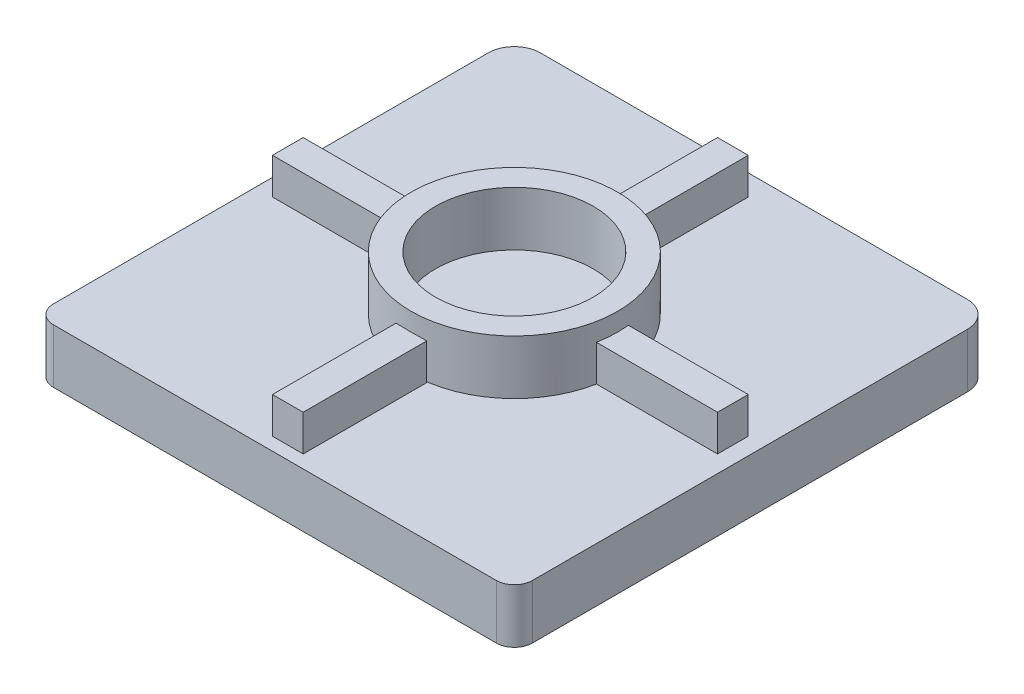
ISO-10303-21;
HEADER;
FILE_DESCRIPTION(('STEP AP214'),'2;1');
FILE_NAME('part.step','',(''),(''),'','','');
FILE_SCHEMA(('AUTOMOTIVE_DESIGN { 1 0 10303 214 1 1 1 1 }'));
ENDSEC;
DATA;
#1=APPLICATION_CONTEXT('core data for automotive mechanical design processes');
#2=APPLICATION_PROTOCOL_DEFINITION('international standard','automotive_design',2000,#1);
#3=PRODUCT_CONTEXT('',#1,'mechanical');
#4=PRODUCT('Part','Part','',(#3));
#5=PRODUCT_RELATED_PRODUCT_CATEGORY('part','',(#4));
#6=PRODUCT_DEFINITION_FORMATION('','',#4);
#7=PRODUCT_DEFINITION_CONTEXT('part definition',#1,'design');
#8=PRODUCT_DEFINITION('design','',#6,#7);
#9=PRODUCT_DEFINITION_SHAPE('','',#8);
#10=(LENGTH_UNIT() NAMED_UNIT(*) SI_UNIT(.MILLI.,.METRE.));
#11=(NAMED_UNIT(*) PLANE_ANGLE_UNIT() SI_UNIT($,.RADIAN.));
#12=(NAMED_UNIT(*) SI_UNIT($,.STERADIAN.) SOLID_ANGLE_UNIT());
#13=UNCERTAINTY_MEASURE_WITH_UNIT(LENGTH_MEASURE(1.E-05),#10,'distance_accuracy_value','');
#14=(GEOMETRIC_REPRESENTATION_CONTEXT(3) GLOBAL_UNCERTAINTY_ASSIGNED_CONTEXT((#13)) GLOBAL_UNIT_ASSIGNED_CONTEXT((#10,
#11,#12)) REPRESENTATION_CONTEXT('',''));
#15=CARTESIAN_POINT('',(0.,0.,0.));
#16=DIRECTION('',(0.,0.,1.));
#17=DIRECTION('',(1.,0.,0.));
#18=AXIS2_PLACEMENT_3D('',#15,#16,#17);
#19=CARTESIAN_POINT('',(4.572,0.,-72.6121428427258));
#20=DIRECTION('',(0.,1.,0.));
#21=DIRECTION('',(0.,0.,1.));
#22=AXIS2_PLACEMENT_3D('',#19,#20,#21);
#23=PLANE('',#22);
#24=CARTESIAN_POINT('',(4.572,0.,-72.6121428427258));
#25=DIRECTION('',(0.,1.,0.));
#26=DIRECTION('',(0.,0.,1.));
#27=AXIS2_PLACEMENT_3D('',#24,#25,#26);
#28=CIRCLE('',#27,4.572);
#29=CARTESIAN_POINT('',(4.572,0.,-77.1841428427258));
#30=VERTEX_POINT('',#29);
#31=CARTESIAN_POINT('',(0.,0.,-72.6121428427258));
#32=VERTEX_POINT('',#31);
#33=EDGE_CURVE('E312',#30,#32,#28,.T.);
#34=ORIENTED_EDGE('',*,*,#33,.T.);
#35=DIRECTION('',(0.,0.,1.));
#36=VECTOR('',#35,1.);
#37=CARTESIAN_POINT('',(0.,0.,3.7580703769303));
#38=LINE('',#37,#36);
#39=CARTESIAN_POINT('',(0.,0.,3.7580703769303));
#40=VERTEX_POINT('',#39);
#41=EDGE_CURVE('E345',#32,#40,#38,.T.);
#42=ORIENTED_EDGE('',*,*,#41,.T.);
#43=CARTESIAN_POINT('',(3.175,0.,3.75807037693033));
#44=DIRECTION('',(0.,1.,0.));
#45=DIRECTION('',(0.,0.,-1.));
#46=AXIS2_PLACEMENT_3D('',#43,#44,#45);
#47=CIRCLE('',#46,3.175);
#48=CARTESIAN_POINT('',(3.17500000000002,0.,6.93307037693033));
#49=VERTEX_POINT('',#48);
#50=EDGE_CURVE('E348',#40,#49,#47,.T.);
#51=ORIENTED_EDGE('',*,*,#50,.T.);
#52=DIRECTION('',(1.,0.,0.));
#53=VECTOR('',#52,1.);
#54=CARTESIAN_POINT('',(80.9527959262744,0.,6.93307037693033));
#55=LINE('',#54,#53);
#56=CARTESIAN_POINT('',(80.9527959262744,0.,6.93307037693033));
#57=VERTEX_POINT('',#56);
#58=EDGE_CURVE('E351',#49,#57,#55,.T.);
#59=ORIENTED_EDGE('',*,*,#58,.T.);
#60=CARTESIAN_POINT('',(80.9527959262744,0.,3.75807037693033));
#61=DIRECTION('',(0.,1.,0.));
#62=DIRECTION('',(0.,0.,-1.));
#63=AXIS2_PLACEMENT_3D('',#60,#61,#62);
#64=CIRCLE('',#63,3.175);
#65=CARTESIAN_POINT('',(84.1277959262744,0.,3.75807037693031));
#66=VERTEX_POINT('',#65);
#67=EDGE_CURVE('E354',#57,#66,#64,.T.);
#68=ORIENTED_EDGE('',*,*,#67,.T.);
#69=DIRECTION('',(0.,0.,-1.));
#70=VECTOR('',#69,1.);
#71=CARTESIAN_POINT('',(84.1277959262744,0.,3.75807037693031));
#72=LINE('',#71,#70);
#73=CARTESIAN_POINT('',(84.1277959262744,0.,-72.6121428427258));
#74=VERTEX_POINT('',#73);
#75=EDGE_CURVE('E357',#66,#74,#72,.T.);
#76=ORIENTED_EDGE('',*,*,#75,.T.);
#77=CARTESIAN_POINT('',(79.5557959262744,0.,-72.6121428427258));
#78=DIRECTION('',(0.,1.,0.));
#79=DIRECTION('',(0.,0.,1.));
#80=AXIS2_PLACEMENT_3D('',#77,#78,#79);
#81=CIRCLE('',#80,4.57200000000001);
#82=CARTESIAN_POINT('',(79.5557959262744,0.,-77.1841428427258));
#83=VERTEX_POINT('',#82);
#84=EDGE_CURVE('E360',#74,#83,#81,.T.);
#85=ORIENTED_EDGE('',*,*,#84,.T.);
#86=DIRECTION('',(-1.,0.,0.));
#87=VECTOR('',#86,1.);
#88=CARTESIAN_POINT('',(4.572,0.,-77.1841428427258));
#89=LINE('',#88,#87);
#90=EDGE_CURVE('E321',#83,#30,#89,.T.);
#91=ORIENTED_EDGE('',*,*,#90,.T.);
#92=EDGE_LOOP('',(#34,#42,#51,#59,#68,#76,#85,#91));
#93=FACE_BOUND('',#92,.T.);
#94=DIRECTION('',(-1.,0.,0.));
#95=VECTOR('',#94,1.);
#96=CARTESIAN_POINT('',(39.3670969734219,0.,-73.5093637595236));
#97=LINE('',#96,#95);
#98=CARTESIAN_POINT('',(44.7606989528534,0.,-73.5093637595235));
#99=VERTEX_POINT('',#98);
#100=CARTESIAN_POINT('',(39.3670969734219,0.,-73.5093637595236));
#101=VERTEX_POINT('',#100);
#102=EDGE_CURVE('E46',#99,#101,#97,.T.);
#103=ORIENTED_EDGE('',*,*,#102,.F.);
#104=DIRECTION('',(0.,0.,-1.));
#105=VECTOR('',#104,1.);
#106=CARTESIAN_POINT('',(44.7606989528532,0.,-51.8172298559358));
#107=LINE('',#106,#105);
#108=CARTESIAN_POINT('',(44.7606989528532,0.,-53.0644207712562));
#109=VERTEX_POINT('',#108);
#110=EDGE_CURVE('E223',#109,#99,#107,.T.);
#111=ORIENTED_EDGE('',*,*,#110,.F.);
#112=CARTESIAN_POINT('',(42.0638979631372,0.,-35.1308275862069));
#113=DIRECTION('',(0.,1.,0.));
#114=DIRECTION('',(0.,0.,1.));
#115=AXIS2_PLACEMENT_3D('',#112,#113,#114);
#116=CIRCLE('',#115,18.1352281514454);
#117=CARTESIAN_POINT('',(60.0892804193896,0.,-37.1238372226135));
#118=VERTEX_POINT('',#117);
#119=EDGE_CURVE('E313',#118,#109,#116,.T.);
#120=ORIENTED_EDGE('',*,*,#119,.F.);
#121=DIRECTION('',(-1.,0.,0.));
#122=VECTOR('',#121,1.);
#123=CARTESIAN_POINT('',(59.4540915861753,0.,-37.1238372226135));
#124=LINE('',#123,#122);
#125=CARTESIAN_POINT('',(81.146225489763,0.,-37.1238372226135));
#126=VERTEX_POINT('',#125);
#127=EDGE_CURVE('E298',#126,#118,#124,.T.);
#128=ORIENTED_EDGE('',*,*,#127,.F.);
#129=DIRECTION('',(0.,0.,-1.));
#130=VECTOR('',#129,1.);
#131=CARTESIAN_POINT('',(81.146225489763,0.,-37.1238372226135));
#132=LINE('',#131,#130);
#133=CARTESIAN_POINT('',(81.146225489763,0.,-31.730235243182));
#134=VERTEX_POINT('',#133);
#135=EDGE_CURVE('E286',#134,#126,#132,.T.);
#136=ORIENTED_EDGE('',*,*,#135,.F.);
#137=DIRECTION('',(1.,0.,0.));
#138=VECTOR('',#137,1.);
#139=CARTESIAN_POINT('',(59.4540915861753,0.,-31.730235243182));
#140=LINE('',#139,#138);
#141=CARTESIAN_POINT('',(59.8774453869812,0.,-31.730235243182));
#142=VERTEX_POINT('',#141);
#143=EDGE_CURVE('E291',#142,#134,#140,.T.);
#144=ORIENTED_EDGE('',*,*,#143,.F.);
#145=CARTESIAN_POINT('',(43.2862758837082,0.,-17.0368426098596));
#146=VERTEX_POINT('',#145);
#147=EDGE_CURVE('E308',#146,#142,#116,.T.);
#148=ORIENTED_EDGE('',*,*,#147,.F.);
#149=DIRECTION('',(-1.,0.,0.));
#150=VECTOR('',#149,1.);
#151=CARTESIAN_POINT('',(44.7606989528529,0.,-17.0368426098596));
#152=LINE('',#151,#150);
#153=CARTESIAN_POINT('',(44.7606989528529,0.,-17.0368426098596));
#154=VERTEX_POINT('',#153);
#155=EDGE_CURVE('E255',#154,#146,#152,.T.);
#156=ORIENTED_EDGE('',*,*,#155,.F.);
#157=DIRECTION('',(0.,0.,-1.));
#158=VECTOR('',#157,1.);
#159=CARTESIAN_POINT('',(44.7606989528529,0.,-17.0368426098596));
#160=LINE('',#159,#158);
#161=CARTESIAN_POINT('',(44.7606989528528,0.,4.65529129372806));
#162=VERTEX_POINT('',#161);
#163=EDGE_CURVE('E269',#162,#154,#160,.T.);
#164=ORIENTED_EDGE('',*,*,#163,.F.);
#165=DIRECTION('',(1.,0.,0.));
#166=VECTOR('',#165,1.);
#167=CARTESIAN_POINT('',(44.7606989528528,0.,4.65529129372806));
#168=LINE('',#167,#166);
#169=CARTESIAN_POINT('',(39.3670969734213,0.,4.65529129372805));
#170=VERTEX_POINT('',#169);
#171=EDGE_CURVE('E266',#170,#162,#168,.T.);
#172=ORIENTED_EDGE('',*,*,#171,.F.);
#173=DIRECTION('',(0.,0.,1.));
#174=VECTOR('',#173,1.);
#175=CARTESIAN_POINT('',(39.3670969734214,0.,-17.0368426098597));
#176=LINE('',#175,#174);
#177=CARTESIAN_POINT('',(39.3670969734214,0.,-17.0368426098597));
#178=VERTEX_POINT('',#177);
#179=EDGE_CURVE('E250',#178,#170,#176,.T.);
#180=ORIENTED_EDGE('',*,*,#179,.F.);
#181=CARTESIAN_POINT('',(40.8415200425661,0.,-17.0368426098597));
#182=VERTEX_POINT('',#181);
#183=EDGE_CURVE('E272',#182,#178,#152,.T.);
#184=ORIENTED_EDGE('',*,*,#183,.F.);
#185=CARTESIAN_POINT('',(24.2503505392932,0.,-31.7302352431821));
#186=VERTEX_POINT('',#185);
#187=EDGE_CURVE('E419',#186,#182,#116,.T.);
#188=ORIENTED_EDGE('',*,*,#187,.F.);
#189=DIRECTION('',(1.,0.,0.));
#190=VECTOR('',#189,1.);
#191=CARTESIAN_POINT('',(24.6737043400991,0.,-31.7302352431821));
#192=LINE('',#191,#190);
#193=CARTESIAN_POINT('',(2.98157043651139,0.,-31.7302352431823));
#194=VERTEX_POINT('',#193);
#195=EDGE_CURVE('E235',#194,#186,#192,.T.);
#196=ORIENTED_EDGE('',*,*,#195,.F.);
#197=DIRECTION('',(0.,0.,1.));
#198=VECTOR('',#197,1.);
#199=CARTESIAN_POINT('',(2.98157043651139,0.,-31.7302352431823));
#200=LINE('',#199,#198);
#201=CARTESIAN_POINT('',(2.98157043651143,0.,-37.1238372226138));
#202=VERTEX_POINT('',#201);
#203=EDGE_CURVE('E227',#202,#194,#200,.T.);
#204=ORIENTED_EDGE('',*,*,#203,.F.);
#205=DIRECTION('',(-1.,0.,0.));
#206=VECTOR('',#205,1.);
#207=CARTESIAN_POINT('',(24.6737043400991,0.,-37.1238372226136));
#208=LINE('',#207,#206);
#209=CARTESIAN_POINT('',(24.0385155068849,0.,-37.1238372226136));
#210=VERTEX_POINT('',#209);
#211=EDGE_CURVE('E224',#210,#202,#208,.T.);
#212=ORIENTED_EDGE('',*,*,#211,.F.);
#213=CARTESIAN_POINT('',(39.3670969734217,0.,-53.0644207712562));
#214=VERTEX_POINT('',#213);
#215=EDGE_CURVE('E316',#214,#210,#116,.T.);
#216=ORIENTED_EDGE('',*,*,#215,.F.);
#217=DIRECTION('',(0.,0.,1.));
#218=VECTOR('',#217,1.);
#219=CARTESIAN_POINT('',(39.3670969734217,0.,-51.8172298559359));
#220=LINE('',#219,#218);
#221=EDGE_CURVE('E51',#101,#214,#220,.T.);
#222=ORIENTED_EDGE('',*,*,#221,.F.);
#223=EDGE_LOOP('',(#103,#111,#120,#128,#136,#144,#148,#156,#164,#172,#180,#184,#188,#196,#204,
#212,#216,#222));
#224=FACE_BOUND('',#223,.T.);
#225=ADVANCED_FACE('F31',(#93,#224),#23,.T.);
#226=CARTESIAN_POINT('',(42.0638979631372,9.525,-35.1308275862069));
#227=DIRECTION('',(0.,-1.,0.));
#228=DIRECTION('',(0.,0.,-1.));
#229=AXIS2_PLACEMENT_3D('',#226,#227,#228);
#230=CYLINDRICAL_SURFACE('',#229,18.1352281514454);
#231=CARTESIAN_POINT('',(42.0638979631372,9.525,-35.1308275862069));
#232=DIRECTION('',(0.,1.,0.));
#233=DIRECTION('',(0.,0.,1.));
#234=AXIS2_PLACEMENT_3D('',#231,#232,#233);
#235=CIRCLE('',#234,18.1352281514454);
#236=CARTESIAN_POINT('',(42.0638979631372,9.525,-16.9955994347614));
#237=VERTEX_POINT('',#236);
#238=EDGE_CURVE('E309',#237,#237,#235,.T.);
#239=ORIENTED_EDGE('',*,*,#238,.F.);
#240=EDGE_LOOP('',(#239));
#241=FACE_BOUND('',#240,.T.);
#242=DIRECTION('',(0.,-1.,0.));
#243=VECTOR('',#242,1.);
#244=CARTESIAN_POINT('',(44.7606989528532,9.525,-53.0644207712562));
#245=LINE('',#244,#243);
#246=CARTESIAN_POINT('',(44.7606989528532,6.35,-53.0644207712562));
#247=VERTEX_POINT('',#246);
#248=EDGE_CURVE('E11',#247,#109,#245,.T.);
#249=ORIENTED_EDGE('',*,*,#248,.F.);
#250=CARTESIAN_POINT('',(42.0638979631372,6.35,-35.1308275862069));
#251=DIRECTION('',(0.,-1.,0.));
#252=DIRECTION('',(0.,0.,-1.));
#253=AXIS2_PLACEMENT_3D('',#250,#251,#252);
#254=CIRCLE('',#253,18.1352281514454);
#255=CARTESIAN_POINT('',(39.3670969734217,6.35,-53.0644207712562));
#256=VERTEX_POINT('',#255);
#257=EDGE_CURVE('E209',#256,#247,#254,.T.);
#258=ORIENTED_EDGE('',*,*,#257,.F.);
#259=DIRECTION('',(0.,-1.,0.));
#260=VECTOR('',#259,1.);
#261=CARTESIAN_POINT('',(39.3670969734217,9.525,-53.0644207712562));
#262=LINE('',#261,#260);
#263=EDGE_CURVE('E39',#214,#256,#262,.F.);
#264=ORIENTED_EDGE('',*,*,#263,.F.);
#265=ORIENTED_EDGE('',*,*,#215,.T.);
#266=DIRECTION('',(0.,-1.,0.));
#267=VECTOR('',#266,1.);
#268=CARTESIAN_POINT('',(24.0385155068849,9.525,-37.1238372226136));
#269=LINE('',#268,#267);
#270=CARTESIAN_POINT('',(24.0385155068849,6.35,-37.1238372226136));
#271=VERTEX_POINT('',#270);
#272=EDGE_CURVE('E407',#271,#210,#269,.T.);
#273=ORIENTED_EDGE('',*,*,#272,.F.);
#274=CARTESIAN_POINT('',(42.0638979631372,6.35,-35.1308275862069));
#275=DIRECTION('',(0.,-1.,0.));
#276=DIRECTION('',(0.,0.,-1.));
#277=AXIS2_PLACEMENT_3D('',#274,#275,#276);
#278=CIRCLE('',#277,18.1352281514454);
#279=CARTESIAN_POINT('',(24.2503505392932,6.35,-31.7302352431821));
#280=VERTEX_POINT('',#279);
#281=EDGE_CURVE('E401',#280,#271,#278,.T.);
#282=ORIENTED_EDGE('',*,*,#281,.F.);
#283=DIRECTION('',(0.,-1.,0.));
#284=VECTOR('',#283,1.);
#285=CARTESIAN_POINT('',(24.2503505392932,9.525,-31.7302352431821));
#286=LINE('',#285,#284);
#287=EDGE_CURVE('E404',#186,#280,#286,.F.);
#288=ORIENTED_EDGE('',*,*,#287,.F.);
#289=ORIENTED_EDGE('',*,*,#187,.T.);
#290=DIRECTION('',(0.,-1.,0.));
#291=VECTOR('',#290,1.);
#292=CARTESIAN_POINT('',(40.8415200425661,9.525,-17.0368426098597));
#293=LINE('',#292,#291);
#294=CARTESIAN_POINT('',(40.8415200425661,6.35,-17.0368426098597));
#295=VERTEX_POINT('',#294);
#296=EDGE_CURVE('E398',#295,#182,#293,.T.);
#297=ORIENTED_EDGE('',*,*,#296,.F.);
#298=CARTESIAN_POINT('',(42.0638979631372,6.35,-35.1308275862069));
#299=DIRECTION('',(0.,-1.,0.));
#300=DIRECTION('',(0.,0.,-1.));
#301=AXIS2_PLACEMENT_3D('',#298,#299,#300);
#302=CIRCLE('',#301,18.1352281514454);
#303=CARTESIAN_POINT('',(43.2862758837082,6.35,-17.0368426098596));
#304=VERTEX_POINT('',#303);
#305=EDGE_CURVE('E392',#304,#295,#302,.T.);
#306=ORIENTED_EDGE('',*,*,#305,.F.);
#307=DIRECTION('',(0.,-1.,0.));
#308=VECTOR('',#307,1.);
#309=CARTESIAN_POINT('',(43.2862758837082,9.525,-17.0368426098596));
#310=LINE('',#309,#308);
#311=EDGE_CURVE('E395',#146,#304,#310,.F.);
#312=ORIENTED_EDGE('',*,*,#311,.F.);
#313=ORIENTED_EDGE('',*,*,#147,.T.);
#314=DIRECTION('',(0.,-1.,0.));
#315=VECTOR('',#314,1.);
#316=CARTESIAN_POINT('',(59.8774453869812,9.525,-31.730235243182));
#317=LINE('',#316,#315);
#318=CARTESIAN_POINT('',(59.8774453869812,6.35,-31.730235243182));
#319=VERTEX_POINT('',#318);
#320=EDGE_CURVE('E386',#319,#142,#317,.T.);
#321=ORIENTED_EDGE('',*,*,#320,.F.);
#322=CARTESIAN_POINT('',(42.0638979631372,6.35,-35.1308275862069));
#323=DIRECTION('',(0.,1.,0.));
#324=DIRECTION('',(0.,0.,1.));
#325=AXIS2_PLACEMENT_3D('',#322,#323,#324);
#326=CIRCLE('',#325,18.1352281514454);
#327=CARTESIAN_POINT('',(60.0892804193896,6.35,-37.1238372226135));
#328=VERTEX_POINT('',#327);
#329=EDGE_CURVE('E383',#319,#328,#326,.T.);
#330=ORIENTED_EDGE('',*,*,#329,.T.);
#331=DIRECTION('',(0.,-1.,0.));
#332=VECTOR('',#331,1.);
#333=CARTESIAN_POINT('',(60.0892804193896,9.525,-37.1238372226135));
#334=LINE('',#333,#332);
#335=EDGE_CURVE('E389',#118,#328,#334,.F.);
#336=ORIENTED_EDGE('',*,*,#335,.F.);
#337=ORIENTED_EDGE('',*,*,#119,.T.);
#338=EDGE_LOOP('',(#249,#258,#264,#265,#273,#282,#288,#289,#297,#306,#312,#313,#321,#330,#336,#337));
#339=FACE_BOUND('',#338,.T.);
#340=ADVANCED_FACE('F417',(#241,#339),#230,.T.);
#341=CARTESIAN_POINT('',(4.572,-9.525,-72.6121428427258));
#342=DIRECTION('',(0.,1.,0.));
#343=DIRECTION('',(0.,0.,1.));
#344=AXIS2_PLACEMENT_3D('',#341,#342,#343);
#345=CYLINDRICAL_SURFACE('',#344,4.572);
#346=ORIENTED_EDGE('',*,*,#33,.F.);
#347=DIRECTION('',(0.,1.,0.));
#348=VECTOR('',#347,1.);
#349=CARTESIAN_POINT('',(4.572,-9.525,-77.1841428427258));
#350=LINE('',#349,#348);
#351=CARTESIAN_POINT('',(4.572,-9.525,-77.1841428427258));
#352=VERTEX_POINT('',#351);
#353=EDGE_CURVE('E365',#352,#30,#350,.T.);
#354=ORIENTED_EDGE('',*,*,#353,.F.);
#355=CARTESIAN_POINT('',(4.572,-9.525,-72.6121428427258));
#356=DIRECTION('',(0.,1.,0.));
#357=DIRECTION('',(0.,0.,1.));
#358=AXIS2_PLACEMENT_3D('',#355,#356,#357);
#359=CIRCLE('',#358,4.572);
#360=CARTESIAN_POINT('',(0.,-9.525,-72.6121428427258));
#361=VERTEX_POINT('',#360);
#362=EDGE_CURVE('E317',#352,#361,#359,.T.);
#363=ORIENTED_EDGE('',*,*,#362,.T.);
#364=DIRECTION('',(0.,1.,0.));
#365=VECTOR('',#364,1.);
#366=CARTESIAN_POINT('',(0.,-9.525,-72.6121428427258));
#367=LINE('',#366,#365);
#368=EDGE_CURVE('E342',#361,#32,#367,.T.);
#369=ORIENTED_EDGE('',*,*,#368,.T.);
#370=EDGE_LOOP('',(#346,#354,#363,#369));
#371=FACE_BOUND('',#370,.T.);
#372=ADVANCED_FACE('F33',(#371),#345,.T.);
#373=CARTESIAN_POINT('',(4.572,-9.525,-77.1841428427258));
#374=DIRECTION('',(0.,0.,-1.));
#375=DIRECTION('',(-1.,0.,0.));
#376=AXIS2_PLACEMENT_3D('',#373,#374,#375);
#377=PLANE('',#376);
#378=ORIENTED_EDGE('',*,*,#90,.F.);
#379=DIRECTION('',(0.,1.,0.));
#380=VECTOR('',#379,1.);
#381=CARTESIAN_POINT('',(79.5557959262744,-9.525,-77.1841428427258));
#382=LINE('',#381,#380);
#383=CARTESIAN_POINT('',(79.5557959262744,-9.525,-77.1841428427258));
#384=VERTEX_POINT('',#383);
#385=EDGE_CURVE('E368',#384,#83,#382,.T.);
#386=ORIENTED_EDGE('',*,*,#385,.F.);
#387=DIRECTION('',(-1.,0.,0.));
#388=VECTOR('',#387,1.);
#389=CARTESIAN_POINT('',(4.572,-9.525,-77.1841428427258));
#390=LINE('',#389,#388);
#391=EDGE_CURVE('E339',#384,#352,#390,.T.);
#392=ORIENTED_EDGE('',*,*,#391,.T.);
#393=ORIENTED_EDGE('',*,*,#353,.T.);
#394=EDGE_LOOP('',(#378,#386,#392,#393));
#395=FACE_BOUND('',#394,.T.);
#396=ADVANCED_FACE('F463',(#395),#377,.T.);
#397=CARTESIAN_POINT('',(79.5557959262744,-9.525,-72.6121428427258));
#398=DIRECTION('',(0.,1.,0.));
#399=DIRECTION('',(0.,0.,1.));
#400=AXIS2_PLACEMENT_3D('',#397,#398,#399);
#401=CYLINDRICAL_SURFACE('',#400,4.57200000000001);
#402=ORIENTED_EDGE('',*,*,#84,.F.);
#403=DIRECTION('',(0.,1.,0.));
#404=VECTOR('',#403,1.);
#405=CARTESIAN_POINT('',(84.1277959262744,-9.525,-72.6121428427258));
#406=LINE('',#405,#404);
#407=CARTESIAN_POINT('',(84.1277959262744,-9.525,-72.6121428427258));
#408=VERTEX_POINT('',#407);
#409=EDGE_CURVE('E370',#408,#74,#406,.T.);
#410=ORIENTED_EDGE('',*,*,#409,.F.);
#411=CARTESIAN_POINT('',(79.5557959262744,-9.525,-72.6121428427258));
#412=DIRECTION('',(0.,1.,0.));
#413=DIRECTION('',(0.,0.,1.));
#414=AXIS2_PLACEMENT_3D('',#411,#412,#413);
#415=CIRCLE('',#414,4.57200000000001);
#416=EDGE_CURVE('E336',#408,#384,#415,.T.);
#417=ORIENTED_EDGE('',*,*,#416,.T.);
#418=ORIENTED_EDGE('',*,*,#385,.T.);
#419=EDGE_LOOP('',(#402,#410,#417,#418));
#420=FACE_BOUND('',#419,.T.);
#421=ADVANCED_FACE('F466',(#420),#401,.T.);
#422=CARTESIAN_POINT('',(84.1277959262744,-9.525,3.75807037693031));
#423=DIRECTION('',(1.,0.,0.));
#424=DIRECTION('',(0.,0.,-1.));
#425=AXIS2_PLACEMENT_3D('',#422,#423,#424);
#426=PLANE('',#425);
#427=ORIENTED_EDGE('',*,*,#75,.F.);
#428=DIRECTION('',(0.,1.,0.));
#429=VECTOR('',#428,1.);
#430=CARTESIAN_POINT('',(84.1277959262744,-9.525,3.75807037693031));
#431=LINE('',#430,#429);
#432=CARTESIAN_POINT('',(84.1277959262744,-9.525,3.75807037693031));
#433=VERTEX_POINT('',#432);
#434=EDGE_CURVE('E372',#433,#66,#431,.T.);
#435=ORIENTED_EDGE('',*,*,#434,.F.);
#436=DIRECTION('',(0.,0.,-1.));
#437=VECTOR('',#436,1.);
#438=CARTESIAN_POINT('',(84.1277959262744,-9.525,3.75807037693031));
#439=LINE('',#438,#437);
#440=EDGE_CURVE('E333',#433,#408,#439,.T.);
#441=ORIENTED_EDGE('',*,*,#440,.T.);
#442=ORIENTED_EDGE('',*,*,#409,.T.);
#443=EDGE_LOOP('',(#427,#435,#441,#442));
#444=FACE_BOUND('',#443,.T.);
#445=ADVANCED_FACE('F470',(#444),#426,.T.);
#446=CARTESIAN_POINT('',(80.9527959262744,-9.525,3.75807037693033));
#447=DIRECTION('',(0.,1.,0.));
#448=DIRECTION('',(0.,0.,1.));
#449=AXIS2_PLACEMENT_3D('',#446,#447,#448);
#450=CYLINDRICAL_SURFACE('',#449,3.175);
#451=ORIENTED_EDGE('',*,*,#67,.F.);
#452=DIRECTION('',(0.,1.,0.));
#453=VECTOR('',#452,1.);
#454=CARTESIAN_POINT('',(80.9527959262744,-9.525,6.93307037693033));
#455=LINE('',#454,#453);
#456=CARTESIAN_POINT('',(80.9527959262744,-9.525,6.93307037693033));
#457=VERTEX_POINT('',#456);
#458=EDGE_CURVE('E374',#457,#57,#455,.T.);
#459=ORIENTED_EDGE('',*,*,#458,.F.);
#460=CARTESIAN_POINT('',(80.9527959262744,-9.525,3.75807037693033));
#461=DIRECTION('',(0.,1.,0.));
#462=DIRECTION('',(0.,0.,-1.));
#463=AXIS2_PLACEMENT_3D('',#460,#461,#462);
#464=CIRCLE('',#463,3.175);
#465=EDGE_CURVE('E330',#457,#433,#464,.T.);
#466=ORIENTED_EDGE('',*,*,#465,.T.);
#467=ORIENTED_EDGE('',*,*,#434,.T.);
#468=EDGE_LOOP('',(#451,#459,#466,#467));
#469=FACE_BOUND('',#468,.T.);
#470=ADVANCED_FACE('F474',(#469),#450,.T.);
#471=CARTESIAN_POINT('',(80.9527959262744,-9.525,6.93307037693033));
#472=DIRECTION('',(0.,0.,1.));
#473=DIRECTION('',(1.,0.,0.));
#474=AXIS2_PLACEMENT_3D('',#471,#472,#473);
#475=PLANE('',#474);
#476=ORIENTED_EDGE('',*,*,#58,.F.);
#477=DIRECTION('',(0.,1.,0.));
#478=VECTOR('',#477,1.);
#479=CARTESIAN_POINT('',(3.17500000000002,-9.525,6.93307037693033));
#480=LINE('',#479,#478);
#481=CARTESIAN_POINT('',(3.17500000000002,-9.525,6.93307037693033));
#482=VERTEX_POINT('',#481);
#483=EDGE_CURVE('E376',#482,#49,#480,.T.);
#484=ORIENTED_EDGE('',*,*,#483,.F.);
#485=DIRECTION('',(1.,0.,0.));
#486=VECTOR('',#485,1.);
#487=CARTESIAN_POINT('',(80.9527959262744,-9.525,6.93307037693033));
#488=LINE('',#487,#486);
#489=EDGE_CURVE('E327',#482,#457,#488,.T.);
#490=ORIENTED_EDGE('',*,*,#489,.T.);
#491=ORIENTED_EDGE('',*,*,#458,.T.);
#492=EDGE_LOOP('',(#476,#484,#490,#491));
#493=FACE_BOUND('',#492,.T.);
#494=ADVANCED_FACE('F478',(#493),#475,.T.);
#495=CARTESIAN_POINT('',(3.175,-9.525,3.75807037693033));
#496=DIRECTION('',(0.,1.,0.));
#497=DIRECTION('',(0.,0.,1.));
#498=AXIS2_PLACEMENT_3D('',#495,#496,#497);
#499=CYLINDRICAL_SURFACE('',#498,3.175);
#500=ORIENTED_EDGE('',*,*,#50,.F.);
#501=DIRECTION('',(0.,1.,0.));
#502=VECTOR('',#501,1.);
#503=CARTESIAN_POINT('',(0.,-9.525,3.7580703769303));
#504=LINE('',#503,#502);
#505=CARTESIAN_POINT('',(0.,-9.525,3.7580703769303));
#506=VERTEX_POINT('',#505);
#507=EDGE_CURVE('E378',#506,#40,#504,.T.);
#508=ORIENTED_EDGE('',*,*,#507,.F.);
#509=CARTESIAN_POINT('',(3.175,-9.525,3.75807037693033));
#510=DIRECTION('',(0.,1.,0.));
#511=DIRECTION('',(0.,0.,-1.));
#512=AXIS2_PLACEMENT_3D('',#509,#510,#511);
#513=CIRCLE('',#512,3.175);
#514=EDGE_CURVE('E324',#506,#482,#513,.T.);
#515=ORIENTED_EDGE('',*,*,#514,.T.);
#516=ORIENTED_EDGE('',*,*,#483,.T.);
#517=EDGE_LOOP('',(#500,#508,#515,#516));
#518=FACE_BOUND('',#517,.T.);
#519=ADVANCED_FACE('F482',(#518),#499,.T.);
#520=CARTESIAN_POINT('',(0.,-9.525,3.7580703769303));
#521=DIRECTION('',(-1.,0.,0.));
#522=DIRECTION('',(0.,0.,1.));
#523=AXIS2_PLACEMENT_3D('',#520,#521,#522);
#524=PLANE('',#523);
#525=ORIENTED_EDGE('',*,*,#41,.F.);
#526=ORIENTED_EDGE('',*,*,#368,.F.);
#527=DIRECTION('',(0.,0.,1.));
#528=VECTOR('',#527,1.);
#529=CARTESIAN_POINT('',(0.,-9.525,3.7580703769303));
#530=LINE('',#529,#528);
#531=EDGE_CURVE('E320',#361,#506,#530,.T.);
#532=ORIENTED_EDGE('',*,*,#531,.T.);
#533=ORIENTED_EDGE('',*,*,#507,.T.);
#534=EDGE_LOOP('',(#525,#526,#532,#533));
#535=FACE_BOUND('',#534,.T.);
#536=ADVANCED_FACE('F485',(#535),#524,.T.);
#537=CARTESIAN_POINT('',(4.572,-9.525,-72.6121428427258));
#538=DIRECTION('',(0.,1.,0.));
#539=DIRECTION('',(0.,0.,1.));
#540=AXIS2_PLACEMENT_3D('',#537,#538,#539);
#541=PLANE('',#540);
#542=ORIENTED_EDGE('',*,*,#362,.F.);
#543=ORIENTED_EDGE('',*,*,#391,.F.);
#544=ORIENTED_EDGE('',*,*,#416,.F.);
#545=ORIENTED_EDGE('',*,*,#440,.F.);
#546=ORIENTED_EDGE('',*,*,#465,.F.);
#547=ORIENTED_EDGE('',*,*,#489,.F.);
#548=ORIENTED_EDGE('',*,*,#514,.F.);
#549=ORIENTED_EDGE('',*,*,#531,.F.);
#550=EDGE_LOOP('',(#542,#543,#544,#545,#546,#547,#548,#549));
#551=FACE_BOUND('',#550,.T.);
#552=ADVANCED_FACE('F462',(#551),#541,.F.);
#553=CARTESIAN_POINT('',(42.0638979631372,9.525,-35.1308275862069));
#554=DIRECTION('',(0.,1.,0.));
#555=DIRECTION('',(0.,0.,1.));
#556=AXIS2_PLACEMENT_3D('',#553,#554,#555);
#557=PLANE('',#556);
#558=ORIENTED_EDGE('',*,*,#238,.T.);
#559=EDGE_LOOP('',(#558));
#560=FACE_BOUND('',#559,.T.);
#561=CARTESIAN_POINT('',(42.0638979631372,9.525,-35.1308275862069));
#562=DIRECTION('',(0.,1.,0.));
#563=DIRECTION('',(0.,0.,1.));
#564=AXIS2_PLACEMENT_3D('',#561,#562,#563);
#565=CIRCLE('',#564,13.8499107334643);
#566=CARTESIAN_POINT('',(42.0638979631372,9.525,-48.9807383196712));
#567=VERTEX_POINT('',#566);
#568=EDGE_CURVE('E305',#567,#567,#565,.T.);
#569=ORIENTED_EDGE('',*,*,#568,.F.);
#570=EDGE_LOOP('',(#569));
#571=FACE_BOUND('',#570,.T.);
#572=ADVANCED_FACE('F492',(#560,#571),#557,.T.);
#573=CARTESIAN_POINT('',(42.0638979631372,9.525,-35.1308275862069));
#574=DIRECTION('',(0.,-1.,0.));
#575=DIRECTION('',(0.,0.,-1.));
#576=AXIS2_PLACEMENT_3D('',#573,#574,#575);
#577=CYLINDRICAL_SURFACE('',#576,13.8499107334643);
#578=CARTESIAN_POINT('',(42.0638979631372,0.,-35.1308275862069));
#579=DIRECTION('',(0.,1.,0.));
#580=DIRECTION('',(0.,0.,1.));
#581=AXIS2_PLACEMENT_3D('',#578,#579,#580);
#582=CIRCLE('',#581,13.8499107334643);
#583=CARTESIAN_POINT('',(42.0638979631372,0.,-48.9807383196712));
#584=VERTEX_POINT('',#583);
#585=EDGE_CURVE('E367',#584,#584,#582,.F.);
#586=CARTESIAN_POINT('',(42.0638979631372,9.525,-48.9807383196712));
#587=CARTESIAN_POINT('',(42.0638979631372,9.42578125,-48.9807383196712));
#588=CARTESIAN_POINT('',(42.0638979631372,9.3265625,-48.9807383196712));
#589=CARTESIAN_POINT('',(42.0638979631372,9.128125,-48.9807383196712));
#590=CARTESIAN_POINT('',(42.0638979631372,9.02890625,-48.9807383196712));
#591=CARTESIAN_POINT('',(42.0638979631372,8.83046875,-48.9807383196712));
#592=CARTESIAN_POINT('',(42.0638979631372,8.73125,-48.9807383196712));
#593=CARTESIAN_POINT('',(42.0638979631372,8.5328125,-48.9807383196712));
#594=CARTESIAN_POINT('',(42.0638979631372,8.43359375,-48.9807383196712));
#595=CARTESIAN_POINT('',(42.0638979631372,8.23515625,-48.9807383196712));
#596=CARTESIAN_POINT('',(42.0638979631372,8.1359375,-48.9807383196712));
#597=CARTESIAN_POINT('',(42.0638979631372,7.9375,-48.9807383196712));
#598=CARTESIAN_POINT('',(42.0638979631372,7.83828125,-48.9807383196712));
#599=CARTESIAN_POINT('',(42.0638979631372,7.63984375,-48.9807383196712));
#600=CARTESIAN_POINT('',(42.0638979631372,7.540625,-48.9807383196712));
#601=CARTESIAN_POINT('',(42.0638979631372,7.3421875,-48.9807383196712));
#602=CARTESIAN_POINT('',(42.0638979631372,7.24296875,-48.9807383196712));
#603=CARTESIAN_POINT('',(42.0638979631372,7.04453125,-48.9807383196712));
#604=CARTESIAN_POINT('',(42.0638979631372,6.9453125,-48.9807383196712));
#605=CARTESIAN_POINT('',(42.0638979631372,6.746875,-48.9807383196712));
#606=CARTESIAN_POINT('',(42.0638979631372,6.64765625,-48.9807383196712));
#607=CARTESIAN_POINT('',(42.0638979631372,6.44921875,-48.9807383196712));
#608=CARTESIAN_POINT('',(42.0638979631372,6.35,-48.9807383196712));
#609=CARTESIAN_POINT('',(42.0638979631372,6.1515625,-48.9807383196712));
#610=CARTESIAN_POINT('',(42.0638979631372,6.05234375,-48.9807383196712));
#611=CARTESIAN_POINT('',(42.0638979631372,5.85390625,-48.9807383196712));
#612=CARTESIAN_POINT('',(42.0638979631372,5.7546875,-48.9807383196712));
#613=CARTESIAN_POINT('',(42.0638979631372,5.55625,-48.9807383196712));
#614=CARTESIAN_POINT('',(42.0638979631372,5.45703125,-48.9807383196712));
#615=CARTESIAN_POINT('',(42.0638979631372,5.25859375,-48.9807383196712));
#616=CARTESIAN_POINT('',(42.0638979631372,5.159375,-48.9807383196712));
#617=CARTESIAN_POINT('',(42.0638979631372,4.9609375,-48.9807383196712));
#618=CARTESIAN_POINT('',(42.0638979631372,4.86171875,-48.9807383196712));
#619=CARTESIAN_POINT('',(42.0638979631372,4.66328125,-48.9807383196712));
#620=CARTESIAN_POINT('',(42.0638979631372,4.5640625,-48.9807383196712));
#621=CARTESIAN_POINT('',(42.0638979631372,4.365625,-48.9807383196712));
#622=CARTESIAN_POINT('',(42.0638979631372,4.26640625,-48.9807383196712));
#623=CARTESIAN_POINT('',(42.0638979631372,4.06796875,-48.9807383196712));
#624=CARTESIAN_POINT('',(42.0638979631372,3.96875,-48.9807383196712));
#625=CARTESIAN_POINT('',(42.0638979631372,3.7703125,-48.9807383196712));
#626=CARTESIAN_POINT('',(42.0638979631372,3.67109375,-48.9807383196712));
#627=CARTESIAN_POINT('',(42.0638979631372,3.47265625,-48.9807383196712));
#628=CARTESIAN_POINT('',(42.0638979631372,3.3734375,-48.9807383196712));
#629=CARTESIAN_POINT('',(42.0638979631372,3.175,-48.9807383196712));
#630=CARTESIAN_POINT('',(42.0638979631372,3.07578125,-48.9807383196712));
#631=CARTESIAN_POINT('',(42.0638979631372,2.87734375,-48.9807383196712));
#632=CARTESIAN_POINT('',(42.0638979631372,2.778125,-48.9807383196712));
#633=CARTESIAN_POINT('',(42.0638979631372,2.5796875,-48.9807383196712));
#634=CARTESIAN_POINT('',(42.0638979631372,2.48046875,-48.9807383196712));
#635=CARTESIAN_POINT('',(42.0638979631372,2.28203125,-48.9807383196712));
#636=CARTESIAN_POINT('',(42.0638979631372,2.1828125,-48.9807383196712));
#637=CARTESIAN_POINT('',(42.0638979631372,1.984375,-48.9807383196712));
#638=CARTESIAN_POINT('',(42.0638979631372,1.88515625,-48.9807383196712));
#639=CARTESIAN_POINT('',(42.0638979631372,1.68671875,-48.9807383196712));
#640=CARTESIAN_POINT('',(42.0638979631372,1.5875,-48.9807383196712));
#641=CARTESIAN_POINT('',(42.0638979631372,1.3890625,-48.9807383196712));
#642=CARTESIAN_POINT('',(42.0638979631372,1.28984375,-48.9807383196712));
#643=CARTESIAN_POINT('',(42.0638979631372,1.09140625,-48.9807383196712));
#644=CARTESIAN_POINT('',(42.0638979631372,0.992187500000001,-48.9807383196712));
#645=CARTESIAN_POINT('',(42.0638979631372,0.793750000000001,-48.9807383196712));
#646=CARTESIAN_POINT('',(42.0638979631372,0.69453125,-48.9807383196712));
#647=CARTESIAN_POINT('',(42.0638979631372,0.49609375,-48.9807383196712));
#648=CARTESIAN_POINT('',(42.0638979631372,0.396875,-48.9807383196712));
#649=CARTESIAN_POINT('',(42.0638979631372,0.1984375,-48.9807383196712));
#650=CARTESIAN_POINT('',(42.0638979631372,0.0992187500000001,-48.9807383196712));
#651=CARTESIAN_POINT('',(42.0638979631372,0.,-48.9807383196712));
#652=B_SPLINE_CURVE_WITH_KNOTS('',3,(#586,#587,#588,#589,#590,#591,#592,#593,#594,#595,#596,
#597,#598,#599,#600,#601,#602,#603,#604,#605,#606,#607,#608,#609,#610,#611,#612,#613,#614,#615,
#616,#617,#618,#619,#620,#621,#622,#623,#624,#625,#626,#627,#628,#629,#630,#631,#632,#633,#634,
#635,#636,#637,#638,#639,#640,#641,#642,#643,#644,#645,#646,#647,#648,#649,#650,#651),
.UNSPECIFIED.,.F.,.F.,(4,2,2,2,2,2,2,2,2,2,2,2,2,2,2,2,2,2,2,2,2,2,2,2,2,2,2,2,2,2,2,2,4),(0.,
0.297656249999998,0.595312499999999,0.892968749999999,1.190625,1.48828125,1.7859375,2.08359375,
2.38125,2.67890625,2.9765625,3.27421875,3.571875,3.86953125,4.1671875,4.46484375,4.7625,
5.06015625,5.3578125,5.65546875,5.953125,6.25078125,6.5484375,6.84609375,7.14375,7.44140625,
7.7390625,8.03671875,8.334375,8.63203125,8.9296875,9.22734375,9.525),.UNSPECIFIED.);
#653=EDGE_CURVE('BSEAM449',#567,#584,#652,.T.);
#654=ORIENTED_EDGE('',*,*,#568,.T.);
#655=ORIENTED_EDGE('',*,*,#585,.T.);
#656=ORIENTED_EDGE('',*,*,#653,.T.);
#657=ORIENTED_EDGE('',*,*,#653,.F.);
#658=EDGE_LOOP('',(#654,#656,#655,#657));
#659=FACE_BOUND('',#658,.T.);
#660=ADVANCED_FACE('F449',(#659),#577,.F.);
#661=ORIENTED_EDGE('',*,*,#585,.F.);
#662=EDGE_LOOP('',(#661));
#663=FACE_BOUND('',#662,.T.);
#664=ADVANCED_FACE('F442',(#663),#23,.T.);
#665=CARTESIAN_POINT('',(59.4540915861753,6.35,-37.1238372226135));
#666=DIRECTION('',(0.,0.,1.));
#667=DIRECTION('',(1.,0.,0.));
#668=AXIS2_PLACEMENT_3D('',#665,#666,#667);
#669=PLANE('',#668);
#670=ORIENTED_EDGE('',*,*,#127,.T.);
#671=ORIENTED_EDGE('',*,*,#335,.T.);
#672=DIRECTION('',(-1.,0.,0.));
#673=VECTOR('',#672,1.);
#674=CARTESIAN_POINT('',(59.4540915861753,6.35,-37.1238372226135));
#675=LINE('',#674,#673);
#676=CARTESIAN_POINT('',(81.146225489763,6.35,-37.1238372226135));
#677=VERTEX_POINT('',#676);
#678=EDGE_CURVE('E290',#677,#328,#675,.T.);
#679=ORIENTED_EDGE('',*,*,#678,.F.);
#680=DIRECTION('',(0.,-1.,0.));
#681=VECTOR('',#680,1.);
#682=CARTESIAN_POINT('',(81.146225489763,6.35,-37.1238372226135));
#683=LINE('',#682,#681);
#684=EDGE_CURVE('E303',#677,#126,#683,.T.);
#685=ORIENTED_EDGE('',*,*,#684,.T.);
#686=EDGE_LOOP('',(#670,#671,#679,#685));
#687=FACE_BOUND('',#686,.T.);
#688=ADVANCED_FACE('F440',(#687),#669,.F.);
#689=CARTESIAN_POINT('',(59.4540915861753,6.35,-31.730235243182));
#690=DIRECTION('',(0.,0.,-1.));
#691=DIRECTION('',(-1.,0.,0.));
#692=AXIS2_PLACEMENT_3D('',#689,#690,#691);
#693=PLANE('',#692);
#694=DIRECTION('',(1.,0.,0.));
#695=VECTOR('',#694,1.);
#696=CARTESIAN_POINT('',(59.4540915861753,6.35,-31.730235243182));
#697=LINE('',#696,#695);
#698=CARTESIAN_POINT('',(81.146225489763,6.35,-31.730235243182));
#699=VERTEX_POINT('',#698);
#700=EDGE_CURVE('E293',#319,#699,#697,.T.);
#701=ORIENTED_EDGE('',*,*,#700,.F.);
#702=ORIENTED_EDGE('',*,*,#320,.T.);
#703=ORIENTED_EDGE('',*,*,#143,.T.);
#704=DIRECTION('',(0.,-1.,0.));
#705=VECTOR('',#704,1.);
#706=CARTESIAN_POINT('',(81.146225489763,6.35,-31.730235243182));
#707=LINE('',#706,#705);
#708=EDGE_CURVE('E295',#699,#134,#707,.T.);
#709=ORIENTED_EDGE('',*,*,#708,.F.);
#710=EDGE_LOOP('',(#701,#702,#703,#709));
#711=FACE_BOUND('',#710,.T.);
#712=ADVANCED_FACE('F427',(#711),#693,.F.);
#713=CARTESIAN_POINT('',(81.146225489763,6.35,-31.730235243182));
#714=DIRECTION('',(0.,1.,0.));
#715=DIRECTION('',(0.,0.,1.));
#716=AXIS2_PLACEMENT_3D('',#713,#714,#715);
#717=PLANE('',#716);
#718=ORIENTED_EDGE('',*,*,#329,.F.);
#719=ORIENTED_EDGE('',*,*,#700,.T.);
#720=DIRECTION('',(0.,0.,-1.));
#721=VECTOR('',#720,1.);
#722=CARTESIAN_POINT('',(81.146225489763,6.35,-37.1238372226135));
#723=LINE('',#722,#721);
#724=EDGE_CURVE('E287',#699,#677,#723,.T.);
#725=ORIENTED_EDGE('',*,*,#724,.T.);
#726=ORIENTED_EDGE('',*,*,#678,.T.);
#727=EDGE_LOOP('',(#718,#719,#725,#726));
#728=FACE_BOUND('',#727,.T.);
#729=ADVANCED_FACE('F437',(#728),#717,.T.);
#730=CARTESIAN_POINT('',(81.146225489763,6.35,-37.1238372226135));
#731=DIRECTION('',(-1.,0.,0.));
#732=DIRECTION('',(0.,0.,1.));
#733=AXIS2_PLACEMENT_3D('',#730,#731,#732);
#734=PLANE('',#733);
#735=ORIENTED_EDGE('',*,*,#135,.T.);
#736=ORIENTED_EDGE('',*,*,#684,.F.);
#737=ORIENTED_EDGE('',*,*,#724,.F.);
#738=ORIENTED_EDGE('',*,*,#708,.T.);
#739=EDGE_LOOP('',(#735,#736,#737,#738));
#740=FACE_BOUND('',#739,.T.);
#741=ADVANCED_FACE('F434',(#740),#734,.F.);
#742=CARTESIAN_POINT('',(44.7606989528529,6.35,-17.0368426098596));
#743=DIRECTION('',(0.,0.,1.));
#744=DIRECTION('',(1.,0.,0.));
#745=AXIS2_PLACEMENT_3D('',#742,#743,#744);
#746=PLANE('',#745);
#747=DIRECTION('',(-1.,0.,0.));
#748=VECTOR('',#747,1.);
#749=CARTESIAN_POINT('',(44.7606989528529,6.35,-17.0368426098596));
#750=LINE('',#749,#748);
#751=CARTESIAN_POINT('',(39.3670969734214,6.35,-17.0368426098597));
#752=VERTEX_POINT('',#751);
#753=EDGE_CURVE('E259',#295,#752,#750,.T.);
#754=ORIENTED_EDGE('',*,*,#753,.F.);
#755=ORIENTED_EDGE('',*,*,#296,.T.);
#756=ORIENTED_EDGE('',*,*,#183,.T.);
#757=DIRECTION('',(0.,-1.,0.));
#758=VECTOR('',#757,1.);
#759=CARTESIAN_POINT('',(39.3670969734214,6.35,-17.0368426098597));
#760=LINE('',#759,#758);
#761=EDGE_CURVE('E263',#752,#178,#760,.T.);
#762=ORIENTED_EDGE('',*,*,#761,.F.);
#763=EDGE_LOOP('',(#754,#755,#756,#762));
#764=FACE_BOUND('',#763,.T.);
#765=ADVANCED_FACE('F609',(#764),#746,.F.);
#766=ORIENTED_EDGE('',*,*,#155,.T.);
#767=ORIENTED_EDGE('',*,*,#311,.T.);
#768=CARTESIAN_POINT('',(44.7606989528529,6.35,-17.0368426098596));
#769=VERTEX_POINT('',#768);
#770=EDGE_CURVE('E260',#769,#304,#750,.T.);
#771=ORIENTED_EDGE('',*,*,#770,.F.);
#772=DIRECTION('',(0.,-1.,0.));
#773=VECTOR('',#772,1.);
#774=CARTESIAN_POINT('',(44.7606989528529,6.35,-17.0368426098596));
#775=LINE('',#774,#773);
#776=EDGE_CURVE('E277',#769,#154,#775,.T.);
#777=ORIENTED_EDGE('',*,*,#776,.T.);
#778=EDGE_LOOP('',(#766,#767,#771,#777));
#779=FACE_BOUND('',#778,.T.);
#780=ADVANCED_FACE('F617',(#779),#746,.F.);
#781=CARTESIAN_POINT('',(39.3670969734213,6.35,4.65529129372805));
#782=DIRECTION('',(0.,-1.,0.));
#783=DIRECTION('',(0.,0.,-1.));
#784=AXIS2_PLACEMENT_3D('',#781,#782,#783);
#785=PLANE('',#784);
#786=ORIENTED_EDGE('',*,*,#770,.T.);
#787=ORIENTED_EDGE('',*,*,#305,.T.);
#788=ORIENTED_EDGE('',*,*,#753,.T.);
#789=DIRECTION('',(0.,0.,1.));
#790=VECTOR('',#789,1.);
#791=CARTESIAN_POINT('',(39.3670969734214,6.35,-17.0368426098597));
#792=LINE('',#791,#790);
#793=CARTESIAN_POINT('',(39.3670969734213,6.35,4.65529129372805));
#794=VERTEX_POINT('',#793);
#795=EDGE_CURVE('E251',#752,#794,#792,.T.);
#796=ORIENTED_EDGE('',*,*,#795,.T.);
#797=DIRECTION('',(1.,0.,0.));
#798=VECTOR('',#797,1.);
#799=CARTESIAN_POINT('',(44.7606989528528,6.35,4.65529129372806));
#800=LINE('',#799,#798);
#801=CARTESIAN_POINT('',(44.7606989528528,6.35,4.65529129372806));
#802=VERTEX_POINT('',#801);
#803=EDGE_CURVE('E254',#794,#802,#800,.T.);
#804=ORIENTED_EDGE('',*,*,#803,.T.);
#805=DIRECTION('',(0.,0.,-1.));
#806=VECTOR('',#805,1.);
#807=CARTESIAN_POINT('',(44.7606989528529,6.35,-17.0368426098596));
#808=LINE('',#807,#806);
#809=EDGE_CURVE('E257',#802,#769,#808,.T.);
#810=ORIENTED_EDGE('',*,*,#809,.T.);
#811=EDGE_LOOP('',(#786,#787,#788,#796,#804,#810));
#812=FACE_BOUND('',#811,.T.);
#813=ADVANCED_FACE('F627',(#812),#785,.F.);
#814=CARTESIAN_POINT('',(39.3670969734214,6.35,-17.0368426098597));
#815=DIRECTION('',(1.,0.,0.));
#816=DIRECTION('',(0.,0.,-1.));
#817=AXIS2_PLACEMENT_3D('',#814,#815,#816);
#818=PLANE('',#817);
#819=ORIENTED_EDGE('',*,*,#179,.T.);
#820=DIRECTION('',(0.,-1.,0.));
#821=VECTOR('',#820,1.);
#822=CARTESIAN_POINT('',(39.3670969734213,6.35,4.65529129372805));
#823=LINE('',#822,#821);
#824=EDGE_CURVE('E283',#794,#170,#823,.T.);
#825=ORIENTED_EDGE('',*,*,#824,.F.);
#826=ORIENTED_EDGE('',*,*,#795,.F.);
#827=ORIENTED_EDGE('',*,*,#761,.T.);
#828=EDGE_LOOP('',(#819,#825,#826,#827));
#829=FACE_BOUND('',#828,.T.);
#830=ADVANCED_FACE('F636',(#829),#818,.F.);
#831=CARTESIAN_POINT('',(44.7606989528528,6.35,4.65529129372806));
#832=DIRECTION('',(0.,0.,-1.));
#833=DIRECTION('',(-1.,0.,0.));
#834=AXIS2_PLACEMENT_3D('',#831,#832,#833);
#835=PLANE('',#834);
#836=ORIENTED_EDGE('',*,*,#171,.T.);
#837=DIRECTION('',(0.,-1.,0.));
#838=VECTOR('',#837,1.);
#839=CARTESIAN_POINT('',(44.7606989528528,6.35,4.65529129372806));
#840=LINE('',#839,#838);
#841=EDGE_CURVE('E280',#802,#162,#840,.T.);
#842=ORIENTED_EDGE('',*,*,#841,.F.);
#843=ORIENTED_EDGE('',*,*,#803,.F.);
#844=ORIENTED_EDGE('',*,*,#824,.T.);
#845=EDGE_LOOP('',(#836,#842,#843,#844));
#846=FACE_BOUND('',#845,.T.);
#847=ADVANCED_FACE('F646',(#846),#835,.F.);
#848=CARTESIAN_POINT('',(44.7606989528529,6.35,-17.0368426098596));
#849=DIRECTION('',(-1.,0.,0.));
#850=DIRECTION('',(0.,0.,1.));
#851=AXIS2_PLACEMENT_3D('',#848,#849,#850);
#852=PLANE('',#851);
#853=ORIENTED_EDGE('',*,*,#163,.T.);
#854=ORIENTED_EDGE('',*,*,#776,.F.);
#855=ORIENTED_EDGE('',*,*,#809,.F.);
#856=ORIENTED_EDGE('',*,*,#841,.T.);
#857=EDGE_LOOP('',(#853,#854,#855,#856));
#858=FACE_BOUND('',#857,.T.);
#859=ADVANCED_FACE('F656',(#858),#852,.F.);
#860=CARTESIAN_POINT('',(24.6737043400991,6.35,-37.1238372226136));
#861=DIRECTION('',(0.,0.,1.));
#862=DIRECTION('',(1.,0.,0.));
#863=AXIS2_PLACEMENT_3D('',#860,#861,#862);
#864=PLANE('',#863);
#865=DIRECTION('',(-1.,0.,0.));
#866=VECTOR('',#865,1.);
#867=CARTESIAN_POINT('',(24.6737043400991,6.35,-37.1238372226136));
#868=LINE('',#867,#866);
#869=CARTESIAN_POINT('',(2.98157043651143,6.35,-37.1238372226138));
#870=VERTEX_POINT('',#869);
#871=EDGE_CURVE('E232',#271,#870,#868,.T.);
#872=ORIENTED_EDGE('',*,*,#871,.F.);
#873=ORIENTED_EDGE('',*,*,#272,.T.);
#874=ORIENTED_EDGE('',*,*,#211,.T.);
#875=DIRECTION('',(0.,-1.,0.));
#876=VECTOR('',#875,1.);
#877=CARTESIAN_POINT('',(2.98157043651143,6.35,-37.1238372226138));
#878=LINE('',#877,#876);
#879=EDGE_CURVE('E247',#870,#202,#878,.T.);
#880=ORIENTED_EDGE('',*,*,#879,.F.);
#881=EDGE_LOOP('',(#872,#873,#874,#880));
#882=FACE_BOUND('',#881,.T.);
#883=ADVANCED_FACE('F666',(#882),#864,.F.);
#884=CARTESIAN_POINT('',(24.6737043400991,6.35,-31.7302352431821));
#885=DIRECTION('',(0.,0.,-1.));
#886=DIRECTION('',(-1.,0.,0.));
#887=AXIS2_PLACEMENT_3D('',#884,#885,#886);
#888=PLANE('',#887);
#889=ORIENTED_EDGE('',*,*,#195,.T.);
#890=ORIENTED_EDGE('',*,*,#287,.T.);
#891=DIRECTION('',(1.,0.,0.));
#892=VECTOR('',#891,1.);
#893=CARTESIAN_POINT('',(24.6737043400991,6.35,-31.7302352431821));
#894=LINE('',#893,#892);
#895=CARTESIAN_POINT('',(2.98157043651139,6.35,-31.7302352431823));
#896=VERTEX_POINT('',#895);
#897=EDGE_CURVE('E237',#896,#280,#894,.T.);
#898=ORIENTED_EDGE('',*,*,#897,.F.);
#899=DIRECTION('',(0.,-1.,0.));
#900=VECTOR('',#899,1.);
#901=CARTESIAN_POINT('',(2.98157043651139,6.35,-31.7302352431823));
#902=LINE('',#901,#900);
#903=EDGE_CURVE('E239',#896,#194,#902,.T.);
#904=ORIENTED_EDGE('',*,*,#903,.T.);
#905=EDGE_LOOP('',(#889,#890,#898,#904));
#906=FACE_BOUND('',#905,.T.);
#907=ADVANCED_FACE('F676',(#906),#888,.F.);
#908=CARTESIAN_POINT('',(2.98157043651143,6.35,-37.1238372226138));
#909=DIRECTION('',(0.,-1.,0.));
#910=DIRECTION('',(0.,0.,-1.));
#911=AXIS2_PLACEMENT_3D('',#908,#909,#910);
#912=PLANE('',#911);
#913=ORIENTED_EDGE('',*,*,#897,.T.);
#914=ORIENTED_EDGE('',*,*,#281,.T.);
#915=ORIENTED_EDGE('',*,*,#871,.T.);
#916=DIRECTION('',(0.,0.,1.));
#917=VECTOR('',#916,1.);
#918=CARTESIAN_POINT('',(2.98157043651139,6.35,-31.7302352431823));
#919=LINE('',#918,#917);
#920=EDGE_CURVE('E234',#870,#896,#919,.T.);
#921=ORIENTED_EDGE('',*,*,#920,.T.);
#922=EDGE_LOOP('',(#913,#914,#915,#921));
#923=FACE_BOUND('',#922,.T.);
#924=ADVANCED_FACE('F686',(#923),#912,.F.);
#925=CARTESIAN_POINT('',(2.98157043651139,6.35,-31.7302352431823));
#926=DIRECTION('',(1.,0.,0.));
#927=DIRECTION('',(0.,0.,-1.));
#928=AXIS2_PLACEMENT_3D('',#925,#926,#927);
#929=PLANE('',#928);
#930=ORIENTED_EDGE('',*,*,#203,.T.);
#931=ORIENTED_EDGE('',*,*,#903,.F.);
#932=ORIENTED_EDGE('',*,*,#920,.F.);
#933=ORIENTED_EDGE('',*,*,#879,.T.);
#934=EDGE_LOOP('',(#930,#931,#932,#933));
#935=FACE_BOUND('',#934,.T.);
#936=ADVANCED_FACE('F696',(#935),#929,.F.);
#937=CARTESIAN_POINT('',(44.7606989528532,6.35,-51.8172298559358));
#938=DIRECTION('',(-1.,0.,0.));
#939=DIRECTION('',(0.,0.,1.));
#940=AXIS2_PLACEMENT_3D('',#937,#938,#939);
#941=PLANE('',#940);
#942=DIRECTION('',(0.,0.,-1.));
#943=VECTOR('',#942,1.);
#944=CARTESIAN_POINT('',(44.7606989528532,6.35,-51.8172298559358));
#945=LINE('',#944,#943);
#946=CARTESIAN_POINT('',(44.7606989528534,6.35,-73.5093637595235));
#947=VERTEX_POINT('',#946);
#948=EDGE_CURVE('E203',#247,#947,#945,.T.);
#949=ORIENTED_EDGE('',*,*,#948,.F.);
#950=ORIENTED_EDGE('',*,*,#248,.T.);
#951=ORIENTED_EDGE('',*,*,#110,.T.);
#952=DIRECTION('',(0.,-1.,0.));
#953=VECTOR('',#952,1.);
#954=CARTESIAN_POINT('',(44.7606989528534,6.35,-73.5093637595235));
#955=LINE('',#954,#953);
#956=EDGE_CURVE('E216',#947,#99,#955,.T.);
#957=ORIENTED_EDGE('',*,*,#956,.F.);
#958=EDGE_LOOP('',(#949,#950,#951,#957));
#959=FACE_BOUND('',#958,.T.);
#960=ADVANCED_FACE('F222',(#959),#941,.F.);
#961=CARTESIAN_POINT('',(39.3670969734217,6.35,-51.8172298559359));
#962=DIRECTION('',(1.,0.,0.));
#963=DIRECTION('',(0.,0.,-1.));
#964=AXIS2_PLACEMENT_3D('',#961,#962,#963);
#965=PLANE('',#964);
#966=ORIENTED_EDGE('',*,*,#221,.T.);
#967=ORIENTED_EDGE('',*,*,#263,.T.);
#968=DIRECTION('',(0.,0.,1.));
#969=VECTOR('',#968,1.);
#970=CARTESIAN_POINT('',(39.3670969734217,6.35,-51.8172298559359));
#971=LINE('',#970,#969);
#972=CARTESIAN_POINT('',(39.3670969734219,6.35,-73.5093637595236));
#973=VERTEX_POINT('',#972);
#974=EDGE_CURVE('E220',#973,#256,#971,.T.);
#975=ORIENTED_EDGE('',*,*,#974,.F.);
#976=DIRECTION('',(0.,-1.,0.));
#977=VECTOR('',#976,1.);
#978=CARTESIAN_POINT('',(39.3670969734219,6.35,-73.5093637595236));
#979=LINE('',#978,#977);
#980=EDGE_CURVE('E218',#973,#101,#979,.T.);
#981=ORIENTED_EDGE('',*,*,#980,.T.);
#982=EDGE_LOOP('',(#966,#967,#975,#981));
#983=FACE_BOUND('',#982,.T.);
#984=ADVANCED_FACE('F412',(#983),#965,.F.);
#985=CARTESIAN_POINT('',(44.7606989528534,6.35,-73.5093637595235));
#986=DIRECTION('',(0.,-1.,0.));
#987=DIRECTION('',(0.,0.,-1.));
#988=AXIS2_PLACEMENT_3D('',#985,#986,#987);
#989=PLANE('',#988);
#990=ORIENTED_EDGE('',*,*,#974,.T.);
#991=ORIENTED_EDGE('',*,*,#257,.T.);
#992=ORIENTED_EDGE('',*,*,#948,.T.);
#993=DIRECTION('',(-1.,0.,0.));
#994=VECTOR('',#993,1.);
#995=CARTESIAN_POINT('',(39.3670969734219,6.35,-73.5093637595236));
#996=LINE('',#995,#994);
#997=EDGE_CURVE('E207',#947,#973,#996,.T.);
#998=ORIENTED_EDGE('',*,*,#997,.T.);
#999=EDGE_LOOP('',(#990,#991,#992,#998));
#1000=FACE_BOUND('',#999,.T.);
#1001=ADVANCED_FACE('F206',(#1000),#989,.F.);
#1002=CARTESIAN_POINT('',(39.3670969734219,6.35,-73.5093637595236));
#1003=DIRECTION('',(0.,0.,1.));
#1004=DIRECTION('',(1.,0.,0.));
#1005=AXIS2_PLACEMENT_3D('',#1002,#1003,#1004);
#1006=PLANE('',#1005);
#1007=ORIENTED_EDGE('',*,*,#102,.T.);
#1008=ORIENTED_EDGE('',*,*,#980,.F.);
#1009=ORIENTED_EDGE('',*,*,#997,.F.);
#1010=ORIENTED_EDGE('',*,*,#956,.T.);
#1011=EDGE_LOOP('',(#1007,#1008,#1009,#1010));
#1012=FACE_BOUND('',#1011,.T.);
#1013=ADVANCED_FACE('F215',(#1012),#1006,.F.);
#1014=CLOSED_SHELL('',(#225,#340,#372,#396,#421,#445,#470,#494,#519,#536,#552,#572,#660,#664,
#688,#712,#729,#741,#765,#780,#813,#830,#847,#859,#883,#907,#924,#936,#960,#984,#1001,#1013));
#1015=MANIFOLD_SOLID_BREP('B2',#1014);
#1016=ADVANCED_BREP_SHAPE_REPRESENTATION('',(#18,#1015),#14);
#1017=SHAPE_DEFINITION_REPRESENTATION(#9,#1016);
ENDSEC;
END-ISO-10303-21;
